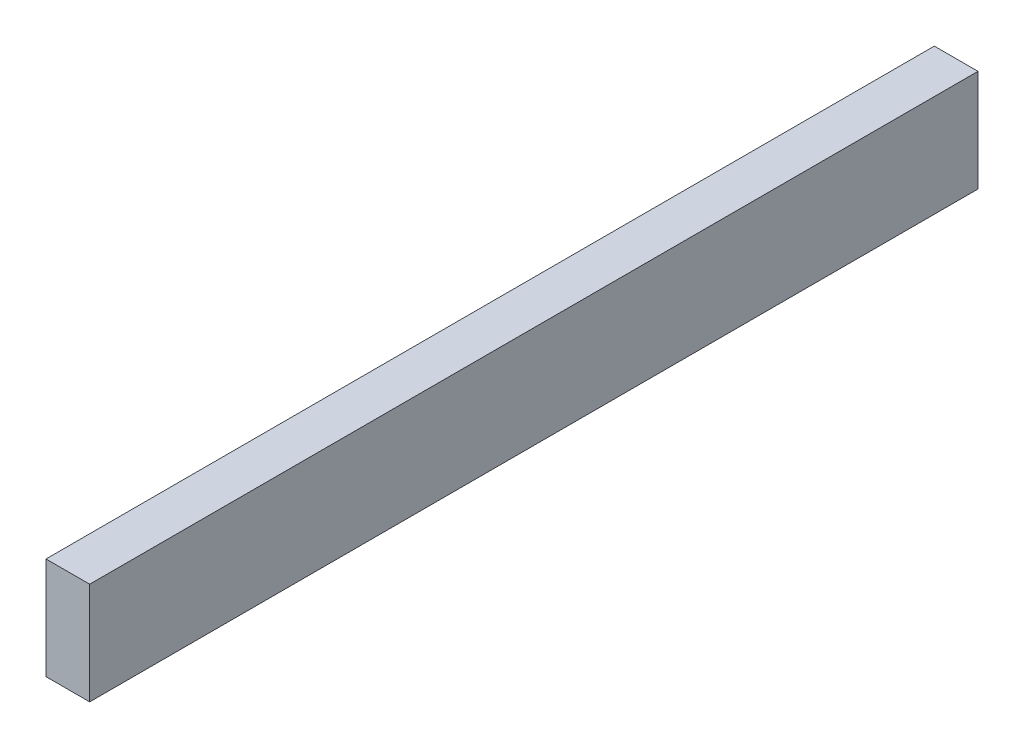
ISO-10303-21;
HEADER;
FILE_DESCRIPTION(('STEP AP214'),'2;1');
FILE_NAME('part.step','',(''),(''),'','','');
FILE_SCHEMA(('AUTOMOTIVE_DESIGN { 1 0 10303 214 1 1 1 1 }'));
ENDSEC;
DATA;
#1=APPLICATION_CONTEXT('core data for automotive mechanical design processes');
#2=APPLICATION_PROTOCOL_DEFINITION('international standard','automotive_design',2000,#1);
#3=PRODUCT_CONTEXT('',#1,'mechanical');
#4=PRODUCT('Part','Part','',(#3));
#5=PRODUCT_RELATED_PRODUCT_CATEGORY('part','',(#4));
#6=PRODUCT_DEFINITION_FORMATION('','',#4);
#7=PRODUCT_DEFINITION_CONTEXT('part definition',#1,'design');
#8=PRODUCT_DEFINITION('design','',#6,#7);
#9=PRODUCT_DEFINITION_SHAPE('','',#8);
#10=(LENGTH_UNIT() NAMED_UNIT(*) SI_UNIT(.MILLI.,.METRE.));
#11=(NAMED_UNIT(*) PLANE_ANGLE_UNIT() SI_UNIT($,.RADIAN.));
#12=(NAMED_UNIT(*) SI_UNIT($,.STERADIAN.) SOLID_ANGLE_UNIT());
#13=UNCERTAINTY_MEASURE_WITH_UNIT(LENGTH_MEASURE(1.E-05),#10,'distance_accuracy_value','');
#14=(GEOMETRIC_REPRESENTATION_CONTEXT(3) GLOBAL_UNCERTAINTY_ASSIGNED_CONTEXT((#13)) GLOBAL_UNIT_ASSIGNED_CONTEXT((#10,
#11,#12)) REPRESENTATION_CONTEXT('',''));
#15=CARTESIAN_POINT('',(0.,0.,0.));
#16=DIRECTION('',(0.,0.,1.));
#17=DIRECTION('',(1.,0.,0.));
#18=AXIS2_PLACEMENT_3D('',#15,#16,#17);
#19=CARTESIAN_POINT('',(-477.303345950127,-432.283106815198,774.7));
#20=DIRECTION('',(1.,0.,0.));
#21=DIRECTION('',(0.,0.,-1.));
#22=AXIS2_PLACEMENT_3D('',#19,#20,#21);
#23=PLANE('',#22);
#24=DIRECTION('',(0.,-1.,0.));
#25=VECTOR('',#24,1.);
#26=CARTESIAN_POINT('',(-477.303345950127,-432.283106815198,0.));
#27=LINE('',#26,#25);
#28=CARTESIAN_POINT('',(-477.303345950127,-432.283106815198,0.));
#29=VERTEX_POINT('',#28);
#30=CARTESIAN_POINT('',(-477.303345950127,-521.183106815198,0.));
#31=VERTEX_POINT('',#30);
#32=EDGE_CURVE('E95',#29,#31,#27,.T.);
#33=ORIENTED_EDGE('',*,*,#32,.T.);
#34=DIRECTION('',(0.,0.,-1.));
#35=VECTOR('',#34,1.);
#36=CARTESIAN_POINT('',(-477.303345950127,-521.183106815198,774.7));
#37=LINE('',#36,#35);
#38=CARTESIAN_POINT('',(-477.303345950127,-521.183106815198,774.7));
#39=VERTEX_POINT('',#38);
#40=EDGE_CURVE('E11',#39,#31,#37,.T.);
#41=ORIENTED_EDGE('',*,*,#40,.F.);
#42=DIRECTION('',(0.,-1.,0.));
#43=VECTOR('',#42,1.);
#44=CARTESIAN_POINT('',(-477.303345950127,-432.283106815198,774.7));
#45=LINE('',#44,#43);
#46=CARTESIAN_POINT('',(-477.303345950127,-432.283106815198,774.7));
#47=VERTEX_POINT('',#46);
#48=EDGE_CURVE('E83',#47,#39,#45,.T.);
#49=ORIENTED_EDGE('',*,*,#48,.F.);
#50=DIRECTION('',(0.,0.,-1.));
#51=VECTOR('',#50,1.);
#52=CARTESIAN_POINT('',(-477.303345950127,-432.283106815198,774.7));
#53=LINE('',#52,#51);
#54=EDGE_CURVE('E91',#47,#29,#53,.T.);
#55=ORIENTED_EDGE('',*,*,#54,.T.);
#56=EDGE_LOOP('',(#33,#41,#49,#55));
#57=FACE_BOUND('',#56,.T.);
#58=ADVANCED_FACE('F32',(#57),#23,.F.);
#59=CARTESIAN_POINT('',(-477.303345950127,-521.183106815198,774.7));
#60=DIRECTION('',(0.,1.,0.));
#61=DIRECTION('',(0.,0.,1.));
#62=AXIS2_PLACEMENT_3D('',#59,#60,#61);
#63=PLANE('',#62);
#64=DIRECTION('',(1.,0.,0.));
#65=VECTOR('',#64,1.);
#66=CARTESIAN_POINT('',(-477.303345950127,-521.183106815198,0.));
#67=LINE('',#66,#65);
#68=CARTESIAN_POINT('',(-439.203345950127,-521.183106815198,0.));
#69=VERTEX_POINT('',#68);
#70=EDGE_CURVE('E87',#31,#69,#67,.T.);
#71=ORIENTED_EDGE('',*,*,#70,.T.);
#72=DIRECTION('',(0.,0.,-1.));
#73=VECTOR('',#72,1.);
#74=CARTESIAN_POINT('',(-439.203345950127,-521.183106815198,774.7));
#75=LINE('',#74,#73);
#76=CARTESIAN_POINT('',(-439.203345950127,-521.183106815198,774.7));
#77=VERTEX_POINT('',#76);
#78=EDGE_CURVE('E40',#77,#69,#75,.T.);
#79=ORIENTED_EDGE('',*,*,#78,.F.);
#80=DIRECTION('',(1.,0.,0.));
#81=VECTOR('',#80,1.);
#82=CARTESIAN_POINT('',(-477.303345950127,-521.183106815198,774.7));
#83=LINE('',#82,#81);
#84=EDGE_CURVE('E78',#39,#77,#83,.T.);
#85=ORIENTED_EDGE('',*,*,#84,.F.);
#86=ORIENTED_EDGE('',*,*,#40,.T.);
#87=EDGE_LOOP('',(#71,#79,#85,#86));
#88=FACE_BOUND('',#87,.T.);
#89=ADVANCED_FACE('F86',(#88),#63,.F.);
#90=CARTESIAN_POINT('',(-439.203345950127,-432.283106815198,774.7));
#91=DIRECTION('',(-1.,0.,0.));
#92=DIRECTION('',(0.,0.,1.));
#93=AXIS2_PLACEMENT_3D('',#90,#91,#92);
#94=PLANE('',#93);
#95=DIRECTION('',(0.,1.,0.));
#96=VECTOR('',#95,1.);
#97=CARTESIAN_POINT('',(-439.203345950127,-432.283106815198,0.));
#98=LINE('',#97,#96);
#99=CARTESIAN_POINT('',(-439.203345950127,-432.283106815198,0.));
#100=VERTEX_POINT('',#99);
#101=EDGE_CURVE('E65',#69,#100,#98,.T.);
#102=ORIENTED_EDGE('',*,*,#101,.T.);
#103=DIRECTION('',(0.,0.,-1.));
#104=VECTOR('',#103,1.);
#105=CARTESIAN_POINT('',(-439.203345950127,-432.283106815198,774.7));
#106=LINE('',#105,#104);
#107=CARTESIAN_POINT('',(-439.203345950127,-432.283106815198,774.7));
#108=VERTEX_POINT('',#107);
#109=EDGE_CURVE('E88',#108,#100,#106,.T.);
#110=ORIENTED_EDGE('',*,*,#109,.F.);
#111=DIRECTION('',(0.,1.,0.));
#112=VECTOR('',#111,1.);
#113=CARTESIAN_POINT('',(-439.203345950127,-432.283106815198,774.7));
#114=LINE('',#113,#112);
#115=EDGE_CURVE('E81',#77,#108,#114,.T.);
#116=ORIENTED_EDGE('',*,*,#115,.F.);
#117=ORIENTED_EDGE('',*,*,#78,.T.);
#118=EDGE_LOOP('',(#102,#110,#116,#117));
#119=FACE_BOUND('',#118,.T.);
#120=ADVANCED_FACE('F89',(#119),#94,.F.);
#121=CARTESIAN_POINT('',(-477.303345950127,-432.283106815198,774.7));
#122=DIRECTION('',(0.,-1.,0.));
#123=DIRECTION('',(0.,0.,-1.));
#124=AXIS2_PLACEMENT_3D('',#121,#122,#123);
#125=PLANE('',#124);
#126=DIRECTION('',(-1.,0.,0.));
#127=VECTOR('',#126,1.);
#128=CARTESIAN_POINT('',(-477.303345950127,-432.283106815198,0.));
#129=LINE('',#128,#127);
#130=EDGE_CURVE('E71',#100,#29,#129,.T.);
#131=ORIENTED_EDGE('',*,*,#130,.T.);
#132=ORIENTED_EDGE('',*,*,#54,.F.);
#133=DIRECTION('',(-1.,0.,0.));
#134=VECTOR('',#133,1.);
#135=CARTESIAN_POINT('',(-477.303345950127,-432.283106815198,774.7));
#136=LINE('',#135,#134);
#137=EDGE_CURVE('E48',#108,#47,#136,.T.);
#138=ORIENTED_EDGE('',*,*,#137,.F.);
#139=ORIENTED_EDGE('',*,*,#109,.T.);
#140=EDGE_LOOP('',(#131,#132,#138,#139));
#141=FACE_BOUND('',#140,.T.);
#142=ADVANCED_FACE('F102',(#141),#125,.F.);
#143=CARTESIAN_POINT('',(0.,0.,774.7));
#144=DIRECTION('',(0.,0.,1.));
#145=DIRECTION('',(1.,0.,0.));
#146=AXIS2_PLACEMENT_3D('',#143,#144,#145);
#147=PLANE('',#146);
#148=ORIENTED_EDGE('',*,*,#48,.T.);
#149=ORIENTED_EDGE('',*,*,#84,.T.);
#150=ORIENTED_EDGE('',*,*,#115,.T.);
#151=ORIENTED_EDGE('',*,*,#137,.T.);
#152=EDGE_LOOP('',(#148,#149,#150,#151));
#153=FACE_BOUND('',#152,.T.);
#154=ADVANCED_FACE('F79',(#153),#147,.T.);
#155=CARTESIAN_POINT('',(0.,0.,0.));
#156=DIRECTION('',(0.,0.,1.));
#157=DIRECTION('',(1.,0.,0.));
#158=AXIS2_PLACEMENT_3D('',#155,#156,#157);
#159=PLANE('',#158);
#160=ORIENTED_EDGE('',*,*,#32,.F.);
#161=ORIENTED_EDGE('',*,*,#130,.F.);
#162=ORIENTED_EDGE('',*,*,#101,.F.);
#163=ORIENTED_EDGE('',*,*,#70,.F.);
#164=EDGE_LOOP('',(#160,#161,#162,#163));
#165=FACE_BOUND('',#164,.T.);
#166=ADVANCED_FACE('F105',(#165),#159,.F.);
#167=CLOSED_SHELL('',(#58,#89,#120,#142,#154,#166));
#168=MANIFOLD_SOLID_BREP('B2',#167);
#169=ADVANCED_BREP_SHAPE_REPRESENTATION('',(#18,#168),#14);
#170=SHAPE_DEFINITION_REPRESENTATION(#9,#169);
ENDSEC;
END-ISO-10303-21;
